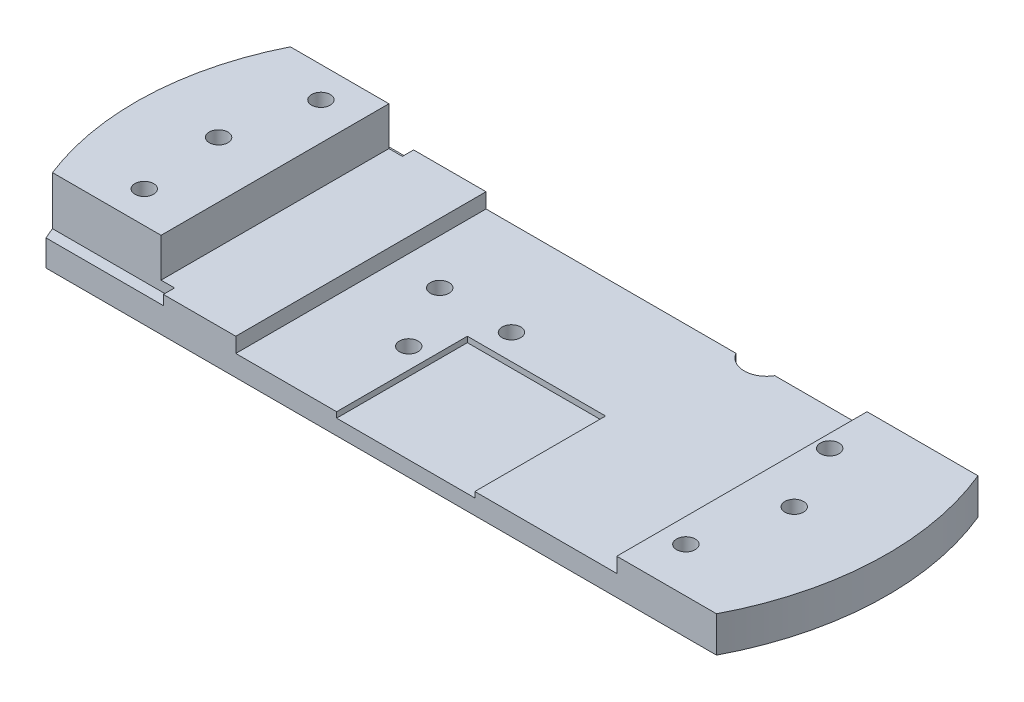
ISO-10303-21;
HEADER;
FILE_DESCRIPTION(('STEP AP214'),'2;1');
FILE_NAME('part.step','',(''),(''),'','','');
FILE_SCHEMA(('AUTOMOTIVE_DESIGN { 1 0 10303 214 1 1 1 1 }'));
ENDSEC;
DATA;
#1=APPLICATION_CONTEXT('core data for automotive mechanical design processes');
#2=APPLICATION_PROTOCOL_DEFINITION('international standard','automotive_design',2000,#1);
#3=PRODUCT_CONTEXT('',#1,'mechanical');
#4=PRODUCT('Part','Part','',(#3));
#5=PRODUCT_RELATED_PRODUCT_CATEGORY('part','',(#4));
#6=PRODUCT_DEFINITION_FORMATION('','',#4);
#7=PRODUCT_DEFINITION_CONTEXT('part definition',#1,'design');
#8=PRODUCT_DEFINITION('design','',#6,#7);
#9=PRODUCT_DEFINITION_SHAPE('','',#8);
#10=(LENGTH_UNIT() NAMED_UNIT(*) SI_UNIT(.MILLI.,.METRE.));
#11=(NAMED_UNIT(*) PLANE_ANGLE_UNIT() SI_UNIT($,.RADIAN.));
#12=(NAMED_UNIT(*) SI_UNIT($,.STERADIAN.) SOLID_ANGLE_UNIT());
#13=UNCERTAINTY_MEASURE_WITH_UNIT(LENGTH_MEASURE(1.E-05),#10,'distance_accuracy_value','');
#14=(GEOMETRIC_REPRESENTATION_CONTEXT(3) GLOBAL_UNCERTAINTY_ASSIGNED_CONTEXT((#13)) GLOBAL_UNIT_ASSIGNED_CONTEXT((#10,
#11,#12)) REPRESENTATION_CONTEXT('',''));
#15=CARTESIAN_POINT('',(0.,0.,0.));
#16=DIRECTION('',(0.,0.,1.));
#17=DIRECTION('',(1.,0.,0.));
#18=AXIS2_PLACEMENT_3D('',#15,#16,#17);
#19=CARTESIAN_POINT('',(0.,20.,0.));
#20=DIRECTION('',(0.,-1.,0.));
#21=DIRECTION('',(0.,0.,-1.));
#22=AXIS2_PLACEMENT_3D('',#19,#20,#21);
#23=PLANE('',#22);
#24=CARTESIAN_POINT('',(-76.2,20.,22.));
#25=DIRECTION('',(0.,-1.,0.));
#26=DIRECTION('',(0.,0.,-1.));
#27=AXIS2_PLACEMENT_3D('',#24,#25,#26);
#28=CIRCLE('',#27,2.50000000000001);
#29=CARTESIAN_POINT('',(-76.2,20.,19.5));
#30=VERTEX_POINT('',#29);
#31=EDGE_CURVE('E319',#30,#30,#28,.T.);
#32=ORIENTED_EDGE('',*,*,#31,.T.);
#33=EDGE_LOOP('',(#32));
#34=FACE_BOUND('',#33,.T.);
#35=CARTESIAN_POINT('',(-78.2,20.,0.100000000000003));
#36=DIRECTION('',(0.,-1.,0.));
#37=DIRECTION('',(0.,0.,-1.));
#38=AXIS2_PLACEMENT_3D('',#35,#36,#37);
#39=CIRCLE('',#38,2.49999999999999);
#40=CARTESIAN_POINT('',(-78.2,20.,-2.39999999999999));
#41=VERTEX_POINT('',#40);
#42=EDGE_CURVE('E327',#41,#41,#39,.T.);
#43=ORIENTED_EDGE('',*,*,#42,.T.);
#44=EDGE_LOOP('',(#43));
#45=FACE_BOUND('',#44,.T.);
#46=CARTESIAN_POINT('',(-73.2,20.,-22.3));
#47=DIRECTION('',(0.,-1.,0.));
#48=DIRECTION('',(0.,0.,-1.));
#49=AXIS2_PLACEMENT_3D('',#46,#47,#48);
#50=CIRCLE('',#49,2.50000000000001);
#51=CARTESIAN_POINT('',(-73.2,20.,-24.8));
#52=VERTEX_POINT('',#51);
#53=EDGE_CURVE('E290',#52,#52,#50,.T.);
#54=ORIENTED_EDGE('',*,*,#53,.T.);
#55=EDGE_LOOP('',(#54));
#56=FACE_BOUND('',#55,.T.);
#57=DIRECTION('',(-1.,0.,0.));
#58=VECTOR('',#57,1.);
#59=CARTESIAN_POINT('',(0.,20.,-30.5));
#60=LINE('',#59,#58);
#61=CARTESIAN_POINT('',(-63.2,20.,-30.5));
#62=VERTEX_POINT('',#61);
#63=CARTESIAN_POINT('',(-89.5873446539231,20.,-30.5));
#64=VERTEX_POINT('',#63);
#65=EDGE_CURVE('E342',#62,#64,#60,.T.);
#66=ORIENTED_EDGE('',*,*,#65,.T.);
#67=CARTESIAN_POINT('',(-22.6589151875398,20.,2.99288439458776));
#68=DIRECTION('',(0.,-1.,0.));
#69=DIRECTION('',(0.,0.,-1.));
#70=AXIS2_PLACEMENT_3D('',#67,#68,#69);
#71=CIRCLE('',#70,74.8410848124602);
#72=CARTESIAN_POINT('',(-92.2616921937509,20.,30.5));
#73=VERTEX_POINT('',#72);
#74=EDGE_CURVE('E476',#73,#64,#71,.T.);
#75=ORIENTED_EDGE('',*,*,#74,.F.);
#76=DIRECTION('',(-1.,0.,0.));
#77=VECTOR('',#76,1.);
#78=CARTESIAN_POINT('',(0.,20.,30.5));
#79=LINE('',#78,#77);
#80=CARTESIAN_POINT('',(-63.2,20.,30.5));
#81=VERTEX_POINT('',#80);
#82=EDGE_CURVE('E371',#81,#73,#79,.T.);
#83=ORIENTED_EDGE('',*,*,#82,.F.);
#84=DIRECTION('',(0.,0.,1.));
#85=VECTOR('',#84,1.);
#86=CARTESIAN_POINT('',(-63.2,20.,-33.5));
#87=LINE('',#86,#85);
#88=EDGE_CURVE('E455',#62,#81,#87,.T.);
#89=ORIENTED_EDGE('',*,*,#88,.F.);
#90=EDGE_LOOP('',(#66,#75,#83,#89));
#91=FACE_BOUND('',#90,.T.);
#92=ADVANCED_FACE('F88',(#34,#45,#56,#91),#23,.F.);
#93=CARTESIAN_POINT('',(-97.5,20.,-33.5));
#94=DIRECTION('',(0.,0.,1.));
#95=DIRECTION('',(1.,0.,0.));
#96=AXIS2_PLACEMENT_3D('',#93,#94,#95);
#97=PLANE('',#96);
#98=DIRECTION('',(0.,1.,0.));
#99=VECTOR('',#98,1.);
#100=CARTESIAN_POINT('',(-59.5873446539231,7.,-33.5));
#101=LINE('',#100,#99);
#102=CARTESIAN_POINT('',(-59.5873446539231,7.,-33.5));
#103=VERTEX_POINT('',#102);
#104=CARTESIAN_POINT('',(-59.5873446539231,9.6,-33.5));
#105=VERTEX_POINT('',#104);
#106=EDGE_CURVE('E360',#103,#105,#101,.T.);
#107=ORIENTED_EDGE('',*,*,#106,.T.);
#108=DIRECTION('',(1.,0.,0.));
#109=VECTOR('',#108,1.);
#110=CARTESIAN_POINT('',(0.,9.6,-33.5));
#111=LINE('',#110,#109);
#112=CARTESIAN_POINT('',(-40.2,9.6,-33.5));
#113=VERTEX_POINT('',#112);
#114=EDGE_CURVE('E410',#105,#113,#111,.T.);
#115=ORIENTED_EDGE('',*,*,#114,.T.);
#116=DIRECTION('',(0.,-1.,0.));
#117=VECTOR('',#116,1.);
#118=CARTESIAN_POINT('',(-40.1999999999999,-2.7894353493707E-13,-33.5));
#119=LINE('',#118,#117);
#120=CARTESIAN_POINT('',(-40.2,5.6,-33.5));
#121=VERTEX_POINT('',#120);
#122=EDGE_CURVE('E413',#113,#121,#119,.T.);
#123=ORIENTED_EDGE('',*,*,#122,.T.);
#124=DIRECTION('',(1.,0.,0.));
#125=VECTOR('',#124,1.);
#126=CARTESIAN_POINT('',(0.,5.6,-33.5));
#127=LINE('',#126,#125);
#128=CARTESIAN_POINT('',(26.7038475772934,5.6,-33.5));
#129=VERTEX_POINT('',#128);
#130=EDGE_CURVE('E418',#121,#129,#127,.T.);
#131=ORIENTED_EDGE('',*,*,#130,.T.);
#132=DIRECTION('',(0.,-1.,0.));
#133=VECTOR('',#132,1.);
#134=CARTESIAN_POINT('',(26.7038475772934,20.,-33.5));
#135=LINE('',#134,#133);
#136=CARTESIAN_POINT('',(26.7038475772934,0.,-33.5));
#137=VERTEX_POINT('',#136);
#138=EDGE_CURVE('E492',#129,#137,#135,.T.);
#139=ORIENTED_EDGE('',*,*,#138,.T.);
#140=DIRECTION('',(-1.,0.,0.));
#141=VECTOR('',#140,1.);
#142=CARTESIAN_POINT('',(-97.5,0.,-33.5));
#143=LINE('',#142,#141);
#144=CARTESIAN_POINT('',(-88.,0.,-33.5));
#145=VERTEX_POINT('',#144);
#146=EDGE_CURVE('E495',#137,#145,#143,.T.);
#147=ORIENTED_EDGE('',*,*,#146,.T.);
#148=DIRECTION('',(0.,-1.,0.));
#149=VECTOR('',#148,1.);
#150=CARTESIAN_POINT('',(-88.,20.,-33.5));
#151=LINE('',#150,#149);
#152=CARTESIAN_POINT('',(-88.,7.,-33.5));
#153=VERTEX_POINT('',#152);
#154=EDGE_CURVE('E472',#153,#145,#151,.T.);
#155=ORIENTED_EDGE('',*,*,#154,.F.);
#156=DIRECTION('',(-1.,0.,0.));
#157=VECTOR('',#156,1.);
#158=CARTESIAN_POINT('',(0.,7.,-33.5));
#159=LINE('',#158,#157);
#160=EDGE_CURVE('E345',#103,#153,#159,.T.);
#161=ORIENTED_EDGE('',*,*,#160,.F.);
#162=EDGE_LOOP('',(#107,#115,#123,#131,#139,#147,#155,#161));
#163=FACE_BOUND('',#162,.T.);
#164=ADVANCED_FACE('F564',(#163),#97,.F.);
#165=CARTESIAN_POINT('',(-22.6589151875398,20.,2.99288439458776));
#166=DIRECTION('',(0.,-1.,0.));
#167=DIRECTION('',(0.,0.,-1.));
#168=AXIS2_PLACEMENT_3D('',#165,#166,#167);
#169=CYLINDRICAL_SURFACE('',#168,74.8410848124602);
#170=ORIENTED_EDGE('',*,*,#74,.T.);
#171=DIRECTION('',(0.,1.,0.));
#172=VECTOR('',#171,1.);
#173=CARTESIAN_POINT('',(-89.5873446539231,7.,-30.5));
#174=LINE('',#173,#172);
#175=CARTESIAN_POINT('',(-89.5873446539231,7.,-30.5));
#176=VERTEX_POINT('',#175);
#177=EDGE_CURVE('E356',#176,#64,#174,.T.);
#178=ORIENTED_EDGE('',*,*,#177,.F.);
#179=CARTESIAN_POINT('',(-22.6589151875398,7.,2.99288439458776));
#180=DIRECTION('',(0.,1.,0.));
#181=DIRECTION('',(0.,0.,1.));
#182=AXIS2_PLACEMENT_3D('',#179,#180,#181);
#183=CIRCLE('',#182,74.8410848124602);
#184=EDGE_CURVE('E348',#153,#176,#183,.T.);
#185=ORIENTED_EDGE('',*,*,#184,.F.);
#186=ORIENTED_EDGE('',*,*,#154,.T.);
#187=CARTESIAN_POINT('',(-22.6589151875398,0.,2.99288439458776));
#188=DIRECTION('',(0.,-1.,0.));
#189=DIRECTION('',(0.,0.,-1.));
#190=AXIS2_PLACEMENT_3D('',#187,#188,#189);
#191=CIRCLE('',#190,74.8410848124602);
#192=CARTESIAN_POINT('',(-91.,0.,33.5));
#193=VERTEX_POINT('',#192);
#194=EDGE_CURVE('E480',#193,#145,#191,.T.);
#195=ORIENTED_EDGE('',*,*,#194,.F.);
#196=DIRECTION('',(0.,-1.,0.));
#197=VECTOR('',#196,1.);
#198=CARTESIAN_POINT('',(-91.,20.,33.5));
#199=LINE('',#198,#197);
#200=CARTESIAN_POINT('',(-91.,7.,33.5));
#201=VERTEX_POINT('',#200);
#202=EDGE_CURVE('E443',#201,#193,#199,.T.);
#203=ORIENTED_EDGE('',*,*,#202,.F.);
#204=CARTESIAN_POINT('',(-22.6589151875398,7.,2.99288439458776));
#205=DIRECTION('',(0.,1.,0.));
#206=DIRECTION('',(0.,0.,1.));
#207=AXIS2_PLACEMENT_3D('',#204,#205,#206);
#208=CIRCLE('',#207,74.8410848124602);
#209=CARTESIAN_POINT('',(-92.2616921937509,7.,30.5));
#210=VERTEX_POINT('',#209);
#211=EDGE_CURVE('E379',#210,#201,#208,.T.);
#212=ORIENTED_EDGE('',*,*,#211,.F.);
#213=DIRECTION('',(0.,1.,0.));
#214=VECTOR('',#213,1.);
#215=CARTESIAN_POINT('',(-92.2616921937509,7.,30.5));
#216=LINE('',#215,#214);
#217=EDGE_CURVE('E355',#210,#73,#216,.T.);
#218=ORIENTED_EDGE('',*,*,#217,.T.);
#219=EDGE_LOOP('',(#170,#178,#185,#186,#195,#203,#212,#218));
#220=FACE_BOUND('',#219,.T.);
#221=ADVANCED_FACE('F570',(#220),#169,.T.);
#222=CARTESIAN_POINT('',(-63.2,0.,-33.5));
#223=DIRECTION('',(-1.,0.,0.));
#224=DIRECTION('',(0.,-1.,0.));
#225=AXIS2_PLACEMENT_3D('',#222,#223,#224);
#226=PLANE('',#225);
#227=DIRECTION('',(0.,-1.,0.));
#228=VECTOR('',#227,1.);
#229=CARTESIAN_POINT('',(-63.2,0.,-30.5));
#230=LINE('',#229,#228);
#231=CARTESIAN_POINT('',(-63.2,9.6,-30.5));
#232=VERTEX_POINT('',#231);
#233=EDGE_CURVE('E397',#62,#232,#230,.T.);
#234=ORIENTED_EDGE('',*,*,#233,.F.);
#235=ORIENTED_EDGE('',*,*,#88,.T.);
#236=DIRECTION('',(0.,-1.,0.));
#237=VECTOR('',#236,1.);
#238=CARTESIAN_POINT('',(-63.2,0.,30.5));
#239=LINE('',#238,#237);
#240=CARTESIAN_POINT('',(-63.2,9.6,30.5));
#241=VERTEX_POINT('',#240);
#242=EDGE_CURVE('E359',#81,#241,#239,.T.);
#243=ORIENTED_EDGE('',*,*,#242,.T.);
#244=DIRECTION('',(0.,0.,1.));
#245=VECTOR('',#244,1.);
#246=CARTESIAN_POINT('',(-63.2,9.6,-33.5));
#247=LINE('',#246,#245);
#248=EDGE_CURVE('E451',#232,#241,#247,.T.);
#249=ORIENTED_EDGE('',*,*,#248,.F.);
#250=EDGE_LOOP('',(#234,#235,#243,#249));
#251=FACE_BOUND('',#250,.T.);
#252=ADVANCED_FACE('F689',(#251),#226,.F.);
#253=CARTESIAN_POINT('',(0.,9.6,-33.5));
#254=DIRECTION('',(0.,-1.,0.));
#255=DIRECTION('',(0.,0.,-1.));
#256=AXIS2_PLACEMENT_3D('',#253,#254,#255);
#257=PLANE('',#256);
#258=DIRECTION('',(1.,0.,0.));
#259=VECTOR('',#258,1.);
#260=CARTESIAN_POINT('',(0.,9.6,-30.5));
#261=LINE('',#260,#259);
#262=CARTESIAN_POINT('',(-59.5873446539231,9.6,-30.5));
#263=VERTEX_POINT('',#262);
#264=EDGE_CURVE('E12',#232,#263,#261,.T.);
#265=ORIENTED_EDGE('',*,*,#264,.F.);
#266=ORIENTED_EDGE('',*,*,#248,.T.);
#267=DIRECTION('',(1.,0.,0.));
#268=VECTOR('',#267,1.);
#269=CARTESIAN_POINT('',(0.,9.6,30.5));
#270=LINE('',#269,#268);
#271=CARTESIAN_POINT('',(-59.5873446539231,9.6,30.5));
#272=VERTEX_POINT('',#271);
#273=EDGE_CURVE('E515',#241,#272,#270,.T.);
#274=ORIENTED_EDGE('',*,*,#273,.T.);
#275=DIRECTION('',(0.,0.,1.));
#276=VECTOR('',#275,1.);
#277=CARTESIAN_POINT('',(-59.5873446539233,9.6,-33.4999999999999));
#278=LINE('',#277,#276);
#279=CARTESIAN_POINT('',(-59.5873446539231,9.6,33.5));
#280=VERTEX_POINT('',#279);
#281=EDGE_CURVE('E511',#272,#280,#278,.T.);
#282=ORIENTED_EDGE('',*,*,#281,.T.);
#283=DIRECTION('',(1.,0.,0.));
#284=VECTOR('',#283,1.);
#285=CARTESIAN_POINT('',(0.,9.6,33.5));
#286=LINE('',#285,#284);
#287=CARTESIAN_POINT('',(-40.2,9.6,33.5));
#288=VERTEX_POINT('',#287);
#289=EDGE_CURVE('E429',#280,#288,#286,.T.);
#290=ORIENTED_EDGE('',*,*,#289,.T.);
#291=DIRECTION('',(0.,0.,1.));
#292=VECTOR('',#291,1.);
#293=CARTESIAN_POINT('',(-40.2,9.6,-33.5));
#294=LINE('',#293,#292);
#295=EDGE_CURVE('E447',#113,#288,#294,.T.);
#296=ORIENTED_EDGE('',*,*,#295,.F.);
#297=ORIENTED_EDGE('',*,*,#114,.F.);
#298=DIRECTION('',(0.,0.,-1.));
#299=VECTOR('',#298,1.);
#300=CARTESIAN_POINT('',(-59.5873446539231,9.6,-33.5));
#301=LINE('',#300,#299);
#302=EDGE_CURVE('E98',#263,#105,#301,.T.);
#303=ORIENTED_EDGE('',*,*,#302,.F.);
#304=EDGE_LOOP('',(#265,#266,#274,#282,#290,#296,#297,#303));
#305=FACE_BOUND('',#304,.T.);
#306=ADVANCED_FACE('F579',(#305),#257,.F.);
#307=CARTESIAN_POINT('',(0.,0.,0.));
#308=DIRECTION('',(0.,-1.,0.));
#309=DIRECTION('',(0.,0.,-1.));
#310=AXIS2_PLACEMENT_3D('',#307,#308,#309);
#311=PLANE('',#310);
#312=CARTESIAN_POINT('',(-8.20000000000003,0.,-8.3));
#313=DIRECTION('',(0.,-1.,0.));
#314=DIRECTION('',(0.,0.,-1.));
#315=AXIS2_PLACEMENT_3D('',#312,#313,#314);
#316=CIRCLE('',#315,2.5);
#317=CARTESIAN_POINT('',(-8.20000000000003,0.,-10.8));
#318=VERTEX_POINT('',#317);
#319=EDGE_CURVE('E310',#318,#318,#316,.T.);
#320=ORIENTED_EDGE('',*,*,#319,.F.);
#321=EDGE_LOOP('',(#320));
#322=FACE_BOUND('',#321,.T.);
#323=CARTESIAN_POINT('',(-18.7,0.,8.7));
#324=DIRECTION('',(0.,-1.,0.));
#325=DIRECTION('',(0.,0.,-1.));
#326=AXIS2_PLACEMENT_3D('',#323,#324,#325);
#327=CIRCLE('',#326,2.5);
#328=CARTESIAN_POINT('',(-18.7,0.,6.2));
#329=VERTEX_POINT('',#328);
#330=EDGE_CURVE('E315',#329,#329,#327,.T.);
#331=ORIENTED_EDGE('',*,*,#330,.F.);
#332=EDGE_LOOP('',(#331));
#333=FACE_BOUND('',#332,.T.);
#334=CARTESIAN_POINT('',(-76.2,0.,22.));
#335=DIRECTION('',(0.,-1.,0.));
#336=DIRECTION('',(0.,0.,-1.));
#337=AXIS2_PLACEMENT_3D('',#334,#335,#336);
#338=CIRCLE('',#337,2.50000000000001);
#339=CARTESIAN_POINT('',(-76.2,0.,19.5));
#340=VERTEX_POINT('',#339);
#341=EDGE_CURVE('E323',#340,#340,#338,.T.);
#342=ORIENTED_EDGE('',*,*,#341,.F.);
#343=EDGE_LOOP('',(#342));
#344=FACE_BOUND('',#343,.T.);
#345=CARTESIAN_POINT('',(-78.2,0.,0.100000000000003));
#346=DIRECTION('',(0.,-1.,0.));
#347=DIRECTION('',(0.,0.,-1.));
#348=AXIS2_PLACEMENT_3D('',#345,#346,#347);
#349=CIRCLE('',#348,2.49999999999999);
#350=CARTESIAN_POINT('',(-78.2,0.,-2.39999999999999));
#351=VERTEX_POINT('',#350);
#352=EDGE_CURVE('E294',#351,#351,#349,.T.);
#353=ORIENTED_EDGE('',*,*,#352,.F.);
#354=EDGE_LOOP('',(#353));
#355=FACE_BOUND('',#354,.T.);
#356=CARTESIAN_POINT('',(-73.2,0.,-22.3));
#357=DIRECTION('',(0.,-1.,0.));
#358=DIRECTION('',(0.,0.,-1.));
#359=AXIS2_PLACEMENT_3D('',#356,#357,#358);
#360=CIRCLE('',#359,2.50000000000001);
#361=CARTESIAN_POINT('',(-73.2,0.,-24.8));
#362=VERTEX_POINT('',#361);
#363=EDGE_CURVE('E295',#362,#362,#360,.T.);
#364=ORIENTED_EDGE('',*,*,#363,.F.);
#365=EDGE_LOOP('',(#364));
#366=FACE_BOUND('',#365,.T.);
#367=CARTESIAN_POINT('',(65.3,0.,-20.));
#368=DIRECTION('',(0.,-1.,0.));
#369=DIRECTION('',(0.,0.,-1.));
#370=AXIS2_PLACEMENT_3D('',#367,#368,#369);
#371=CIRCLE('',#370,2.50000000000001);
#372=CARTESIAN_POINT('',(65.3,0.,-22.5));
#373=VERTEX_POINT('',#372);
#374=EDGE_CURVE('E299',#373,#373,#371,.T.);
#375=ORIENTED_EDGE('',*,*,#374,.F.);
#376=EDGE_LOOP('',(#375));
#377=FACE_BOUND('',#376,.T.);
#378=CARTESIAN_POINT('',(74.1,0.,-1.7));
#379=DIRECTION('',(0.,-1.,0.));
#380=DIRECTION('',(0.,0.,-1.));
#381=AXIS2_PLACEMENT_3D('',#378,#379,#380);
#382=CIRCLE('',#381,2.5);
#383=CARTESIAN_POINT('',(74.1,0.,-4.2));
#384=VERTEX_POINT('',#383);
#385=EDGE_CURVE('E303',#384,#384,#382,.T.);
#386=ORIENTED_EDGE('',*,*,#385,.F.);
#387=EDGE_LOOP('',(#386));
#388=FACE_BOUND('',#387,.T.);
#389=CARTESIAN_POINT('',(68.3,0.,21.5));
#390=DIRECTION('',(0.,-1.,0.));
#391=DIRECTION('',(0.,0.,-1.));
#392=AXIS2_PLACEMENT_3D('',#389,#390,#391);
#393=CIRCLE('',#392,2.5);
#394=CARTESIAN_POINT('',(68.3,0.,19.));
#395=VERTEX_POINT('',#394);
#396=EDGE_CURVE('E284',#395,#395,#393,.T.);
#397=ORIENTED_EDGE('',*,*,#396,.F.);
#398=EDGE_LOOP('',(#397));
#399=FACE_BOUND('',#398,.T.);
#400=CARTESIAN_POINT('',(-28.1,0.,-9.));
#401=DIRECTION('',(0.,-1.,0.));
#402=DIRECTION('',(0.,0.,-1.));
#403=AXIS2_PLACEMENT_3D('',#400,#401,#402);
#404=CIRCLE('',#403,2.5);
#405=CARTESIAN_POINT('',(-28.1,0.,-11.5));
#406=VERTEX_POINT('',#405);
#407=EDGE_CURVE('E314',#406,#406,#404,.T.);
#408=ORIENTED_EDGE('',*,*,#407,.F.);
#409=EDGE_LOOP('',(#408));
#410=FACE_BOUND('',#409,.T.);
#411=CARTESIAN_POINT('',(18.092213290183,0.,-3.21975164372315));
#412=DIRECTION('',(0.,-1.,0.));
#413=DIRECTION('',(0.,0.,-1.));
#414=AXIS2_PLACEMENT_3D('',#411,#412,#413);
#415=CIRCLE('',#414,79.407786709817);
#416=CARTESIAN_POINT('',(91.5,0.,-33.5));
#417=VERTEX_POINT('',#416);
#418=CARTESIAN_POINT('',(88.5,0.,33.5));
#419=VERTEX_POINT('',#418);
#420=EDGE_CURVE('E467',#417,#419,#415,.T.);
#421=ORIENTED_EDGE('',*,*,#420,.T.);
#422=DIRECTION('',(1.,0.,0.));
#423=VECTOR('',#422,1.);
#424=CARTESIAN_POINT('',(-97.5,0.,33.5));
#425=LINE('',#424,#423);
#426=EDGE_CURVE('E500',#193,#419,#425,.T.);
#427=ORIENTED_EDGE('',*,*,#426,.F.);
#428=ORIENTED_EDGE('',*,*,#194,.T.);
#429=ORIENTED_EDGE('',*,*,#146,.F.);
#430=CARTESIAN_POINT('',(31.9,0.,-36.5));
#431=DIRECTION('',(0.,-1.,0.));
#432=DIRECTION('',(0.,0.,-1.));
#433=AXIS2_PLACEMENT_3D('',#430,#431,#432);
#434=CIRCLE('',#433,6.);
#435=CARTESIAN_POINT('',(37.0961524227066,0.,-33.5));
#436=VERTEX_POINT('',#435);
#437=EDGE_CURVE('E464',#436,#137,#434,.T.);
#438=ORIENTED_EDGE('',*,*,#437,.F.);
#439=EDGE_CURVE('E499',#417,#436,#143,.T.);
#440=ORIENTED_EDGE('',*,*,#439,.F.);
#441=EDGE_LOOP('',(#421,#427,#428,#429,#438,#440));
#442=FACE_BOUND('',#441,.T.);
#443=ADVANCED_FACE('F577',(#322,#333,#344,#355,#366,#377,#388,#399,#410,#442),#311,.T.);
#444=CARTESIAN_POINT('',(-97.5,20.,33.5));
#445=DIRECTION('',(0.,0.,-1.));
#446=DIRECTION('',(-1.,0.,0.));
#447=AXIS2_PLACEMENT_3D('',#444,#445,#446);
#448=PLANE('',#447);
#449=DIRECTION('',(1.,0.,0.));
#450=VECTOR('',#449,1.);
#451=CARTESIAN_POINT('',(-13.2,4.1,33.5));
#452=LINE('',#451,#450);
#453=CARTESIAN_POINT('',(-13.2,4.1,33.5));
#454=VERTEX_POINT('',#453);
#455=CARTESIAN_POINT('',(23.8,4.1,33.5));
#456=VERTEX_POINT('',#455);
#457=EDGE_CURVE('E258',#454,#456,#452,.T.);
#458=ORIENTED_EDGE('',*,*,#457,.F.);
#459=DIRECTION('',(0.,1.,0.));
#460=VECTOR('',#459,1.);
#461=CARTESIAN_POINT('',(-13.2,4.1,33.5));
#462=LINE('',#461,#460);
#463=CARTESIAN_POINT('',(-13.2,5.6,33.5));
#464=VERTEX_POINT('',#463);
#465=EDGE_CURVE('E240',#454,#464,#462,.T.);
#466=ORIENTED_EDGE('',*,*,#465,.T.);
#467=DIRECTION('',(1.,0.,0.));
#468=VECTOR('',#467,1.);
#469=CARTESIAN_POINT('',(0.,5.6,33.5));
#470=LINE('',#469,#468);
#471=CARTESIAN_POINT('',(-40.2,5.6,33.5));
#472=VERTEX_POINT('',#471);
#473=EDGE_CURVE('E406',#472,#464,#470,.T.);
#474=ORIENTED_EDGE('',*,*,#473,.F.);
#475=DIRECTION('',(0.,-1.,0.));
#476=VECTOR('',#475,1.);
#477=CARTESIAN_POINT('',(-40.1999999999999,-2.7894353493707E-13,33.5));
#478=LINE('',#477,#476);
#479=EDGE_CURVE('E432',#288,#472,#478,.T.);
#480=ORIENTED_EDGE('',*,*,#479,.F.);
#481=ORIENTED_EDGE('',*,*,#289,.F.);
#482=DIRECTION('',(0.,1.,0.));
#483=VECTOR('',#482,1.);
#484=CARTESIAN_POINT('',(-59.5873446539231,7.,33.5));
#485=LINE('',#484,#483);
#486=CARTESIAN_POINT('',(-59.5873446539231,7.,33.5));
#487=VERTEX_POINT('',#486);
#488=EDGE_CURVE('E382',#487,#280,#485,.T.);
#489=ORIENTED_EDGE('',*,*,#488,.F.);
#490=DIRECTION('',(1.,0.,0.));
#491=VECTOR('',#490,1.);
#492=CARTESIAN_POINT('',(0.,7.,33.5));
#493=LINE('',#492,#491);
#494=EDGE_CURVE('E366',#201,#487,#493,.T.);
#495=ORIENTED_EDGE('',*,*,#494,.F.);
#496=ORIENTED_EDGE('',*,*,#202,.T.);
#497=ORIENTED_EDGE('',*,*,#426,.T.);
#498=DIRECTION('',(0.,-1.,0.));
#499=VECTOR('',#498,1.);
#500=CARTESIAN_POINT('',(88.5,20.,33.5));
#501=LINE('',#500,#499);
#502=CARTESIAN_POINT('',(88.5,9.59999999999996,33.5));
#503=VERTEX_POINT('',#502);
#504=EDGE_CURVE('E461',#503,#419,#501,.T.);
#505=ORIENTED_EDGE('',*,*,#504,.F.);
#506=DIRECTION('',(1.,0.,0.));
#507=VECTOR('',#506,1.);
#508=CARTESIAN_POINT('',(0.,9.6,33.5));
#509=LINE('',#508,#507);
#510=CARTESIAN_POINT('',(61.8,9.59999999999997,33.5));
#511=VERTEX_POINT('',#510);
#512=EDGE_CURVE('E426',#511,#503,#509,.T.);
#513=ORIENTED_EDGE('',*,*,#512,.F.);
#514=DIRECTION('',(0.,1.,0.));
#515=VECTOR('',#514,1.);
#516=CARTESIAN_POINT('',(61.8,0.,33.5));
#517=LINE('',#516,#515);
#518=CARTESIAN_POINT('',(61.8,5.59999999999999,33.5));
#519=VERTEX_POINT('',#518);
#520=EDGE_CURVE('E400',#519,#511,#517,.T.);
#521=ORIENTED_EDGE('',*,*,#520,.F.);
#522=CARTESIAN_POINT('',(23.8,5.6,33.5));
#523=VERTEX_POINT('',#522);
#524=EDGE_CURVE('E436',#523,#519,#470,.T.);
#525=ORIENTED_EDGE('',*,*,#524,.F.);
#526=DIRECTION('',(0.,1.,0.));
#527=VECTOR('',#526,1.);
#528=CARTESIAN_POINT('',(23.8,4.1,33.5));
#529=LINE('',#528,#527);
#530=EDGE_CURVE('E106',#456,#523,#529,.T.);
#531=ORIENTED_EDGE('',*,*,#530,.F.);
#532=EDGE_LOOP('',(#458,#466,#474,#480,#481,#489,#495,#496,#497,#505,#513,#521,#525,#531));
#533=FACE_BOUND('',#532,.T.);
#534=ADVANCED_FACE('F263',(#533),#448,.F.);
#535=DIRECTION('',(0.,-1.,0.));
#536=VECTOR('',#535,1.);
#537=CARTESIAN_POINT('',(37.0961524227066,20.,-33.5));
#538=LINE('',#537,#536);
#539=CARTESIAN_POINT('',(37.0961524227066,5.6,-33.5));
#540=VERTEX_POINT('',#539);
#541=EDGE_CURVE('E475',#436,#540,#538,.F.);
#542=ORIENTED_EDGE('',*,*,#541,.T.);
#543=CARTESIAN_POINT('',(61.8,5.59999999999999,-33.5));
#544=VERTEX_POINT('',#543);
#545=EDGE_CURVE('E417',#540,#544,#127,.T.);
#546=ORIENTED_EDGE('',*,*,#545,.T.);
#547=DIRECTION('',(0.,1.,0.));
#548=VECTOR('',#547,1.);
#549=CARTESIAN_POINT('',(61.8,0.,-33.5));
#550=LINE('',#549,#548);
#551=CARTESIAN_POINT('',(61.8,9.59999999999997,-33.5));
#552=VERTEX_POINT('',#551);
#553=EDGE_CURVE('E401',#544,#552,#550,.T.);
#554=ORIENTED_EDGE('',*,*,#553,.T.);
#555=DIRECTION('',(1.,0.,0.));
#556=VECTOR('',#555,1.);
#557=CARTESIAN_POINT('',(0.,9.6,-33.5));
#558=LINE('',#557,#556);
#559=CARTESIAN_POINT('',(91.5,9.59999999999996,-33.5));
#560=VERTEX_POINT('',#559);
#561=EDGE_CURVE('E405',#552,#560,#558,.T.);
#562=ORIENTED_EDGE('',*,*,#561,.T.);
#563=DIRECTION('',(0.,-1.,0.));
#564=VECTOR('',#563,1.);
#565=CARTESIAN_POINT('',(91.5,20.,-33.5));
#566=LINE('',#565,#564);
#567=EDGE_CURVE('E471',#560,#417,#566,.T.);
#568=ORIENTED_EDGE('',*,*,#567,.T.);
#569=ORIENTED_EDGE('',*,*,#439,.T.);
#570=EDGE_LOOP('',(#542,#546,#554,#562,#568,#569));
#571=FACE_BOUND('',#570,.T.);
#572=ADVANCED_FACE('F90',(#571),#97,.F.);
#573=CARTESIAN_POINT('',(31.9,20.,-36.5));
#574=DIRECTION('',(0.,-1.,0.));
#575=DIRECTION('',(0.,0.,-1.));
#576=AXIS2_PLACEMENT_3D('',#573,#574,#575);
#577=CYLINDRICAL_SURFACE('',#576,6.);
#578=ORIENTED_EDGE('',*,*,#138,.F.);
#579=CARTESIAN_POINT('',(31.9,5.6,-36.5));
#580=DIRECTION('',(0.,-1.,0.));
#581=DIRECTION('',(1.,0.,0.));
#582=AXIS2_PLACEMENT_3D('',#579,#580,#581);
#583=CIRCLE('',#582,6.);
#584=EDGE_CURVE('E507',#129,#540,#583,.F.);
#585=ORIENTED_EDGE('',*,*,#584,.T.);
#586=ORIENTED_EDGE('',*,*,#541,.F.);
#587=ORIENTED_EDGE('',*,*,#437,.T.);
#588=EDGE_LOOP('',(#578,#585,#586,#587));
#589=FACE_BOUND('',#588,.T.);
#590=ADVANCED_FACE('F575',(#589),#577,.F.);
#591=CARTESIAN_POINT('',(18.092213290183,20.,-3.21975164372315));
#592=DIRECTION('',(0.,-1.,0.));
#593=DIRECTION('',(0.,0.,-1.));
#594=AXIS2_PLACEMENT_3D('',#591,#592,#593);
#595=CYLINDRICAL_SURFACE('',#594,79.407786709817);
#596=ORIENTED_EDGE('',*,*,#567,.F.);
#597=CARTESIAN_POINT('',(18.092213290183,9.59999999999999,-3.21975164372315));
#598=DIRECTION('',(0.,-1.,0.));
#599=DIRECTION('',(1.,0.,0.));
#600=AXIS2_PLACEMENT_3D('',#597,#598,#599);
#601=CIRCLE('',#600,79.407786709817);
#602=EDGE_CURVE('E504',#503,#560,#601,.F.);
#603=ORIENTED_EDGE('',*,*,#602,.F.);
#604=ORIENTED_EDGE('',*,*,#504,.T.);
#605=ORIENTED_EDGE('',*,*,#420,.F.);
#606=EDGE_LOOP('',(#596,#603,#604,#605));
#607=FACE_BOUND('',#606,.T.);
#608=ADVANCED_FACE('F589',(#607),#595,.T.);
#609=CARTESIAN_POINT('',(0.,5.6,-33.5));
#610=DIRECTION('',(0.,-1.,0.));
#611=DIRECTION('',(1.,0.,0.));
#612=AXIS2_PLACEMENT_3D('',#609,#610,#611);
#613=PLANE('',#612);
#614=CARTESIAN_POINT('',(-8.20000000000003,5.6,-8.3));
#615=DIRECTION('',(0.,-1.,0.));
#616=DIRECTION('',(1.,0.,0.));
#617=AXIS2_PLACEMENT_3D('',#614,#615,#616);
#618=CIRCLE('',#617,2.5);
#619=CARTESIAN_POINT('',(-5.70000000000003,5.6,-8.3));
#620=VERTEX_POINT('',#619);
#621=EDGE_CURVE('E92',#620,#620,#618,.T.);
#622=ORIENTED_EDGE('',*,*,#621,.T.);
#623=EDGE_LOOP('',(#622));
#624=FACE_BOUND('',#623,.T.);
#625=CARTESIAN_POINT('',(-18.7,5.6,8.7));
#626=DIRECTION('',(0.,-1.,0.));
#627=DIRECTION('',(1.,0.,0.));
#628=AXIS2_PLACEMENT_3D('',#625,#626,#627);
#629=CIRCLE('',#628,2.5);
#630=CARTESIAN_POINT('',(-16.2,5.6,8.7));
#631=VERTEX_POINT('',#630);
#632=EDGE_CURVE('E535',#631,#631,#629,.T.);
#633=ORIENTED_EDGE('',*,*,#632,.T.);
#634=EDGE_LOOP('',(#633));
#635=FACE_BOUND('',#634,.T.);
#636=CARTESIAN_POINT('',(-28.1,5.6,-9.));
#637=DIRECTION('',(0.,-1.,0.));
#638=DIRECTION('',(1.,0.,0.));
#639=AXIS2_PLACEMENT_3D('',#636,#637,#638);
#640=CIRCLE('',#639,2.5);
#641=CARTESIAN_POINT('',(-25.6,5.6,-9.));
#642=VERTEX_POINT('',#641);
#643=EDGE_CURVE('E532',#642,#642,#640,.T.);
#644=ORIENTED_EDGE('',*,*,#643,.T.);
#645=EDGE_LOOP('',(#644));
#646=FACE_BOUND('',#645,.T.);
#647=ORIENTED_EDGE('',*,*,#473,.T.);
#648=DIRECTION('',(0.,0.,1.));
#649=VECTOR('',#648,1.);
#650=CARTESIAN_POINT('',(-13.2,5.6,-1.5));
#651=LINE('',#650,#649);
#652=CARTESIAN_POINT('',(-13.2,5.6,-1.5));
#653=VERTEX_POINT('',#652);
#654=EDGE_CURVE('E246',#653,#464,#651,.T.);
#655=ORIENTED_EDGE('',*,*,#654,.F.);
#656=DIRECTION('',(-1.,0.,0.));
#657=VECTOR('',#656,1.);
#658=CARTESIAN_POINT('',(-13.2,5.6,-1.5));
#659=LINE('',#658,#657);
#660=CARTESIAN_POINT('',(23.8,5.6,-1.5));
#661=VERTEX_POINT('',#660);
#662=EDGE_CURVE('E261',#661,#653,#659,.T.);
#663=ORIENTED_EDGE('',*,*,#662,.F.);
#664=DIRECTION('',(0.,0.,-1.));
#665=VECTOR('',#664,1.);
#666=CARTESIAN_POINT('',(23.8,5.6,-1.5));
#667=LINE('',#666,#665);
#668=EDGE_CURVE('E275',#523,#661,#667,.T.);
#669=ORIENTED_EDGE('',*,*,#668,.F.);
#670=ORIENTED_EDGE('',*,*,#524,.T.);
#671=DIRECTION('',(0.,0.,1.));
#672=VECTOR('',#671,1.);
#673=CARTESIAN_POINT('',(61.8,5.59999999999999,-33.5));
#674=LINE('',#673,#672);
#675=EDGE_CURVE('E439',#544,#519,#674,.T.);
#676=ORIENTED_EDGE('',*,*,#675,.F.);
#677=ORIENTED_EDGE('',*,*,#545,.F.);
#678=ORIENTED_EDGE('',*,*,#584,.F.);
#679=ORIENTED_EDGE('',*,*,#130,.F.);
#680=DIRECTION('',(0.,0.,1.));
#681=VECTOR('',#680,1.);
#682=CARTESIAN_POINT('',(-40.2,5.6,-33.5));
#683=LINE('',#682,#681);
#684=EDGE_CURVE('E444',#121,#472,#683,.T.);
#685=ORIENTED_EDGE('',*,*,#684,.T.);
#686=EDGE_LOOP('',(#647,#655,#663,#669,#670,#676,#677,#678,#679,#685));
#687=FACE_BOUND('',#686,.T.);
#688=ADVANCED_FACE('F544',(#624,#635,#646,#687),#613,.F.);
#689=CARTESIAN_POINT('',(-40.1999999999999,-2.7894353493707E-13,-33.5));
#690=DIRECTION('',(-1.,0.,0.));
#691=DIRECTION('',(0.,-1.,0.));
#692=AXIS2_PLACEMENT_3D('',#689,#690,#691);
#693=PLANE('',#692);
#694=ORIENTED_EDGE('',*,*,#479,.T.);
#695=ORIENTED_EDGE('',*,*,#684,.F.);
#696=ORIENTED_EDGE('',*,*,#122,.F.);
#697=ORIENTED_EDGE('',*,*,#295,.T.);
#698=EDGE_LOOP('',(#694,#695,#696,#697));
#699=FACE_BOUND('',#698,.T.);
#700=ADVANCED_FACE('F640',(#699),#693,.F.);
#701=CARTESIAN_POINT('',(61.8,0.,-33.5));
#702=DIRECTION('',(1.,0.,0.));
#703=DIRECTION('',(0.,0.,-1.));
#704=AXIS2_PLACEMENT_3D('',#701,#702,#703);
#705=PLANE('',#704);
#706=ORIENTED_EDGE('',*,*,#520,.T.);
#707=DIRECTION('',(0.,0.,1.));
#708=VECTOR('',#707,1.);
#709=CARTESIAN_POINT('',(61.8,9.59999999999997,-33.5));
#710=LINE('',#709,#708);
#711=EDGE_CURVE('E422',#552,#511,#710,.T.);
#712=ORIENTED_EDGE('',*,*,#711,.F.);
#713=ORIENTED_EDGE('',*,*,#553,.F.);
#714=ORIENTED_EDGE('',*,*,#675,.T.);
#715=EDGE_LOOP('',(#706,#712,#713,#714));
#716=FACE_BOUND('',#715,.T.);
#717=ADVANCED_FACE('F611',(#716),#705,.F.);
#718=CARTESIAN_POINT('',(0.,9.6,-33.5));
#719=DIRECTION('',(0.,-1.,0.));
#720=DIRECTION('',(1.,0.,0.));
#721=AXIS2_PLACEMENT_3D('',#718,#719,#720);
#722=PLANE('',#721);
#723=CARTESIAN_POINT('',(65.3,9.59999999999997,-20.));
#724=DIRECTION('',(0.,-1.,0.));
#725=DIRECTION('',(1.,0.,0.));
#726=AXIS2_PLACEMENT_3D('',#723,#724,#725);
#727=CIRCLE('',#726,2.50000000000001);
#728=CARTESIAN_POINT('',(67.8,9.59999999999997,-20.));
#729=VERTEX_POINT('',#728);
#730=EDGE_CURVE('E528',#729,#729,#727,.T.);
#731=ORIENTED_EDGE('',*,*,#730,.T.);
#732=EDGE_LOOP('',(#731));
#733=FACE_BOUND('',#732,.T.);
#734=CARTESIAN_POINT('',(74.1,9.59999999999997,-1.7));
#735=DIRECTION('',(0.,-1.,0.));
#736=DIRECTION('',(1.,0.,0.));
#737=AXIS2_PLACEMENT_3D('',#734,#735,#736);
#738=CIRCLE('',#737,2.5);
#739=CARTESIAN_POINT('',(76.6,9.59999999999997,-1.7));
#740=VERTEX_POINT('',#739);
#741=EDGE_CURVE('E524',#740,#740,#738,.T.);
#742=ORIENTED_EDGE('',*,*,#741,.T.);
#743=EDGE_LOOP('',(#742));
#744=FACE_BOUND('',#743,.T.);
#745=CARTESIAN_POINT('',(68.3,9.59999999999997,21.5));
#746=DIRECTION('',(0.,-1.,0.));
#747=DIRECTION('',(1.,0.,0.));
#748=AXIS2_PLACEMENT_3D('',#745,#746,#747);
#749=CIRCLE('',#748,2.5);
#750=CARTESIAN_POINT('',(70.8,9.59999999999997,21.5));
#751=VERTEX_POINT('',#750);
#752=EDGE_CURVE('E337',#751,#751,#749,.T.);
#753=ORIENTED_EDGE('',*,*,#752,.T.);
#754=EDGE_LOOP('',(#753));
#755=FACE_BOUND('',#754,.T.);
#756=ORIENTED_EDGE('',*,*,#602,.T.);
#757=ORIENTED_EDGE('',*,*,#561,.F.);
#758=ORIENTED_EDGE('',*,*,#711,.T.);
#759=ORIENTED_EDGE('',*,*,#512,.T.);
#760=EDGE_LOOP('',(#756,#757,#758,#759));
#761=FACE_BOUND('',#760,.T.);
#762=ADVANCED_FACE('F616',(#733,#744,#755,#761),#722,.F.);
#763=CARTESIAN_POINT('',(0.,7.,30.5));
#764=DIRECTION('',(0.,0.,-1.));
#765=DIRECTION('',(-1.,0.,0.));
#766=AXIS2_PLACEMENT_3D('',#763,#764,#765);
#767=PLANE('',#766);
#768=ORIENTED_EDGE('',*,*,#82,.T.);
#769=ORIENTED_EDGE('',*,*,#217,.F.);
#770=DIRECTION('',(-1.,0.,0.));
#771=VECTOR('',#770,1.);
#772=CARTESIAN_POINT('',(0.,7.,30.5));
#773=LINE('',#772,#771);
#774=CARTESIAN_POINT('',(-59.5873446539231,7.,30.5));
#775=VERTEX_POINT('',#774);
#776=EDGE_CURVE('E375',#775,#210,#773,.T.);
#777=ORIENTED_EDGE('',*,*,#776,.F.);
#778=DIRECTION('',(0.,1.,0.));
#779=VECTOR('',#778,1.);
#780=CARTESIAN_POINT('',(-59.5873446539231,7.,30.5));
#781=LINE('',#780,#779);
#782=EDGE_CURVE('E388',#775,#272,#781,.T.);
#783=ORIENTED_EDGE('',*,*,#782,.T.);
#784=ORIENTED_EDGE('',*,*,#273,.F.);
#785=ORIENTED_EDGE('',*,*,#242,.F.);
#786=EDGE_LOOP('',(#768,#769,#777,#783,#784,#785));
#787=FACE_BOUND('',#786,.T.);
#788=ADVANCED_FACE('F676',(#787),#767,.F.);
#789=CARTESIAN_POINT('',(-59.5873446539232,7.,1.37823420856376E-13));
#790=DIRECTION('',(1.,0.,0.));
#791=DIRECTION('',(0.,0.,-1.));
#792=AXIS2_PLACEMENT_3D('',#789,#790,#791);
#793=PLANE('',#792);
#794=ORIENTED_EDGE('',*,*,#782,.F.);
#795=DIRECTION('',(0.,0.,-1.));
#796=VECTOR('',#795,1.);
#797=CARTESIAN_POINT('',(-59.5873446539232,7.,1.37823420856376E-13));
#798=LINE('',#797,#796);
#799=EDGE_CURVE('E370',#487,#775,#798,.T.);
#800=ORIENTED_EDGE('',*,*,#799,.F.);
#801=ORIENTED_EDGE('',*,*,#488,.T.);
#802=ORIENTED_EDGE('',*,*,#281,.F.);
#803=EDGE_LOOP('',(#794,#800,#801,#802));
#804=FACE_BOUND('',#803,.T.);
#805=ADVANCED_FACE('F683',(#804),#793,.F.);
#806=CARTESIAN_POINT('',(0.,7.,0.));
#807=DIRECTION('',(0.,1.,0.));
#808=DIRECTION('',(0.,0.,1.));
#809=AXIS2_PLACEMENT_3D('',#806,#807,#808);
#810=PLANE('',#809);
#811=ORIENTED_EDGE('',*,*,#494,.T.);
#812=ORIENTED_EDGE('',*,*,#799,.T.);
#813=ORIENTED_EDGE('',*,*,#776,.T.);
#814=ORIENTED_EDGE('',*,*,#211,.T.);
#815=EDGE_LOOP('',(#811,#812,#813,#814));
#816=FACE_BOUND('',#815,.T.);
#817=ADVANCED_FACE('F710',(#816),#810,.T.);
#818=CARTESIAN_POINT('',(0.,7.,-30.5));
#819=DIRECTION('',(0.,0.,-1.));
#820=DIRECTION('',(-1.,0.,0.));
#821=AXIS2_PLACEMENT_3D('',#818,#819,#820);
#822=PLANE('',#821);
#823=ORIENTED_EDGE('',*,*,#233,.T.);
#824=ORIENTED_EDGE('',*,*,#264,.T.);
#825=DIRECTION('',(0.,1.,0.));
#826=VECTOR('',#825,1.);
#827=CARTESIAN_POINT('',(-59.5873446539231,7.,-30.5));
#828=LINE('',#827,#826);
#829=CARTESIAN_POINT('',(-59.5873446539231,7.,-30.5));
#830=VERTEX_POINT('',#829);
#831=EDGE_CURVE('E114',#830,#263,#828,.T.);
#832=ORIENTED_EDGE('',*,*,#831,.F.);
#833=DIRECTION('',(-1.,0.,0.));
#834=VECTOR('',#833,1.);
#835=CARTESIAN_POINT('',(0.,7.,-30.5));
#836=LINE('',#835,#834);
#837=EDGE_CURVE('E338',#830,#176,#836,.T.);
#838=ORIENTED_EDGE('',*,*,#837,.T.);
#839=ORIENTED_EDGE('',*,*,#177,.T.);
#840=ORIENTED_EDGE('',*,*,#65,.F.);
#841=EDGE_LOOP('',(#823,#824,#832,#838,#839,#840));
#842=FACE_BOUND('',#841,.T.);
#843=ADVANCED_FACE('F712',(#842),#822,.T.);
#844=CARTESIAN_POINT('',(-59.5873446539231,7.,0.));
#845=DIRECTION('',(-1.,0.,0.));
#846=DIRECTION('',(0.,0.,1.));
#847=AXIS2_PLACEMENT_3D('',#844,#845,#846);
#848=PLANE('',#847);
#849=ORIENTED_EDGE('',*,*,#302,.T.);
#850=ORIENTED_EDGE('',*,*,#106,.F.);
#851=DIRECTION('',(0.,0.,1.));
#852=VECTOR('',#851,1.);
#853=CARTESIAN_POINT('',(-59.5873446539231,7.,0.));
#854=LINE('',#853,#852);
#855=EDGE_CURVE('E341',#103,#830,#854,.T.);
#856=ORIENTED_EDGE('',*,*,#855,.T.);
#857=ORIENTED_EDGE('',*,*,#831,.T.);
#858=EDGE_LOOP('',(#849,#850,#856,#857));
#859=FACE_BOUND('',#858,.T.);
#860=ADVANCED_FACE('F669',(#859),#848,.T.);
#861=CARTESIAN_POINT('',(0.,7.,0.));
#862=DIRECTION('',(0.,1.,0.));
#863=DIRECTION('',(0.,0.,1.));
#864=AXIS2_PLACEMENT_3D('',#861,#862,#863);
#865=PLANE('',#864);
#866=ORIENTED_EDGE('',*,*,#837,.F.);
#867=ORIENTED_EDGE('',*,*,#855,.F.);
#868=ORIENTED_EDGE('',*,*,#160,.T.);
#869=ORIENTED_EDGE('',*,*,#184,.T.);
#870=EDGE_LOOP('',(#866,#867,#868,#869));
#871=FACE_BOUND('',#870,.T.);
#872=ADVANCED_FACE('F630',(#871),#865,.T.);
#873=CARTESIAN_POINT('',(68.3,20.,21.5));
#874=DIRECTION('',(0.,-1.,0.));
#875=DIRECTION('',(0.,0.,-1.));
#876=AXIS2_PLACEMENT_3D('',#873,#874,#875);
#877=CYLINDRICAL_SURFACE('',#876,2.5);
#878=ORIENTED_EDGE('',*,*,#396,.T.);
#879=EDGE_LOOP('',(#878));
#880=FACE_BOUND('',#879,.T.);
#881=ORIENTED_EDGE('',*,*,#752,.F.);
#882=EDGE_LOOP('',(#881));
#883=FACE_BOUND('',#882,.T.);
#884=ADVANCED_FACE('F662',(#880,#883),#877,.F.);
#885=CARTESIAN_POINT('',(74.1,20.,-1.7));
#886=DIRECTION('',(0.,-1.,0.));
#887=DIRECTION('',(0.,0.,-1.));
#888=AXIS2_PLACEMENT_3D('',#885,#886,#887);
#889=CYLINDRICAL_SURFACE('',#888,2.5);
#890=ORIENTED_EDGE('',*,*,#385,.T.);
#891=EDGE_LOOP('',(#890));
#892=FACE_BOUND('',#891,.T.);
#893=ORIENTED_EDGE('',*,*,#741,.F.);
#894=EDGE_LOOP('',(#893));
#895=FACE_BOUND('',#894,.T.);
#896=ADVANCED_FACE('F659',(#892,#895),#889,.F.);
#897=CARTESIAN_POINT('',(65.3,20.,-20.));
#898=DIRECTION('',(0.,-1.,0.));
#899=DIRECTION('',(0.,0.,-1.));
#900=AXIS2_PLACEMENT_3D('',#897,#898,#899);
#901=CYLINDRICAL_SURFACE('',#900,2.50000000000001);
#902=ORIENTED_EDGE('',*,*,#374,.T.);
#903=EDGE_LOOP('',(#902));
#904=FACE_BOUND('',#903,.T.);
#905=ORIENTED_EDGE('',*,*,#730,.F.);
#906=EDGE_LOOP('',(#905));
#907=FACE_BOUND('',#906,.T.);
#908=ADVANCED_FACE('F656',(#904,#907),#901,.F.);
#909=CARTESIAN_POINT('',(-28.1,20.,-9.));
#910=DIRECTION('',(0.,-1.,0.));
#911=DIRECTION('',(0.,0.,-1.));
#912=AXIS2_PLACEMENT_3D('',#909,#910,#911);
#913=CYLINDRICAL_SURFACE('',#912,2.5);
#914=ORIENTED_EDGE('',*,*,#407,.T.);
#915=EDGE_LOOP('',(#914));
#916=FACE_BOUND('',#915,.T.);
#917=ORIENTED_EDGE('',*,*,#643,.F.);
#918=EDGE_LOOP('',(#917));
#919=FACE_BOUND('',#918,.T.);
#920=ADVANCED_FACE('F559',(#916,#919),#913,.F.);
#921=CARTESIAN_POINT('',(-18.7,20.,8.7));
#922=DIRECTION('',(0.,-1.,0.));
#923=DIRECTION('',(0.,0.,-1.));
#924=AXIS2_PLACEMENT_3D('',#921,#922,#923);
#925=CYLINDRICAL_SURFACE('',#924,2.5);
#926=ORIENTED_EDGE('',*,*,#330,.T.);
#927=EDGE_LOOP('',(#926));
#928=FACE_BOUND('',#927,.T.);
#929=ORIENTED_EDGE('',*,*,#632,.F.);
#930=EDGE_LOOP('',(#929));
#931=FACE_BOUND('',#930,.T.);
#932=ADVANCED_FACE('F549',(#928,#931),#925,.F.);
#933=CARTESIAN_POINT('',(-8.20000000000003,20.,-8.3));
#934=DIRECTION('',(0.,-1.,0.));
#935=DIRECTION('',(0.,0.,-1.));
#936=AXIS2_PLACEMENT_3D('',#933,#934,#935);
#937=CYLINDRICAL_SURFACE('',#936,2.5);
#938=ORIENTED_EDGE('',*,*,#319,.T.);
#939=EDGE_LOOP('',(#938));
#940=FACE_BOUND('',#939,.T.);
#941=ORIENTED_EDGE('',*,*,#621,.F.);
#942=EDGE_LOOP('',(#941));
#943=FACE_BOUND('',#942,.T.);
#944=ADVANCED_FACE('F546',(#940,#943),#937,.F.);
#945=CARTESIAN_POINT('',(-73.2,20.,-22.3));
#946=DIRECTION('',(0.,-1.,0.));
#947=DIRECTION('',(0.,0.,-1.));
#948=AXIS2_PLACEMENT_3D('',#945,#946,#947);
#949=CYLINDRICAL_SURFACE('',#948,2.50000000000001);
#950=ORIENTED_EDGE('',*,*,#53,.F.);
#951=EDGE_LOOP('',(#950));
#952=FACE_BOUND('',#951,.T.);
#953=ORIENTED_EDGE('',*,*,#363,.T.);
#954=EDGE_LOOP('',(#953));
#955=FACE_BOUND('',#954,.T.);
#956=ADVANCED_FACE('F548',(#952,#955),#949,.F.);
#957=CARTESIAN_POINT('',(-78.2,20.,0.100000000000003));
#958=DIRECTION('',(0.,-1.,0.));
#959=DIRECTION('',(0.,0.,-1.));
#960=AXIS2_PLACEMENT_3D('',#957,#958,#959);
#961=CYLINDRICAL_SURFACE('',#960,2.49999999999999);
#962=ORIENTED_EDGE('',*,*,#42,.F.);
#963=EDGE_LOOP('',(#962));
#964=FACE_BOUND('',#963,.T.);
#965=ORIENTED_EDGE('',*,*,#352,.T.);
#966=EDGE_LOOP('',(#965));
#967=FACE_BOUND('',#966,.T.);
#968=ADVANCED_FACE('F556',(#964,#967),#961,.F.);
#969=CARTESIAN_POINT('',(-76.2,20.,22.));
#970=DIRECTION('',(0.,-1.,0.));
#971=DIRECTION('',(0.,0.,-1.));
#972=AXIS2_PLACEMENT_3D('',#969,#970,#971);
#973=CYLINDRICAL_SURFACE('',#972,2.50000000000001);
#974=ORIENTED_EDGE('',*,*,#31,.F.);
#975=EDGE_LOOP('',(#974));
#976=FACE_BOUND('',#975,.T.);
#977=ORIENTED_EDGE('',*,*,#341,.T.);
#978=EDGE_LOOP('',(#977));
#979=FACE_BOUND('',#978,.T.);
#980=ADVANCED_FACE('F654',(#976,#979),#973,.F.);
#981=CARTESIAN_POINT('',(-13.2,4.1,-1.5));
#982=DIRECTION('',(-1.,0.,0.));
#983=DIRECTION('',(0.,0.,1.));
#984=AXIS2_PLACEMENT_3D('',#981,#982,#983);
#985=PLANE('',#984);
#986=ORIENTED_EDGE('',*,*,#654,.T.);
#987=ORIENTED_EDGE('',*,*,#465,.F.);
#988=DIRECTION('',(0.,0.,1.));
#989=VECTOR('',#988,1.);
#990=CARTESIAN_POINT('',(-13.2,4.1,-1.5));
#991=LINE('',#990,#989);
#992=CARTESIAN_POINT('',(-13.2,4.1,-1.5));
#993=VERTEX_POINT('',#992);
#994=EDGE_CURVE('E243',#993,#454,#991,.T.);
#995=ORIENTED_EDGE('',*,*,#994,.F.);
#996=DIRECTION('',(0.,1.,0.));
#997=VECTOR('',#996,1.);
#998=CARTESIAN_POINT('',(-13.2,4.1,-1.5));
#999=LINE('',#998,#997);
#1000=EDGE_CURVE('E281',#993,#653,#999,.T.);
#1001=ORIENTED_EDGE('',*,*,#1000,.T.);
#1002=EDGE_LOOP('',(#986,#987,#995,#1001));
#1003=FACE_BOUND('',#1002,.T.);
#1004=ADVANCED_FACE('F242',(#1003),#985,.F.);
#1005=CARTESIAN_POINT('',(-13.2,4.1,-1.5));
#1006=DIRECTION('',(0.,0.,-1.));
#1007=DIRECTION('',(-1.,0.,0.));
#1008=AXIS2_PLACEMENT_3D('',#1005,#1006,#1007);
#1009=PLANE('',#1008);
#1010=ORIENTED_EDGE('',*,*,#662,.T.);
#1011=ORIENTED_EDGE('',*,*,#1000,.F.);
#1012=DIRECTION('',(-1.,0.,0.));
#1013=VECTOR('',#1012,1.);
#1014=CARTESIAN_POINT('',(-13.2,4.1,-1.5));
#1015=LINE('',#1014,#1013);
#1016=CARTESIAN_POINT('',(23.8,4.1,-1.5));
#1017=VERTEX_POINT('',#1016);
#1018=EDGE_CURVE('E252',#1017,#993,#1015,.T.);
#1019=ORIENTED_EDGE('',*,*,#1018,.F.);
#1020=DIRECTION('',(0.,1.,0.));
#1021=VECTOR('',#1020,1.);
#1022=CARTESIAN_POINT('',(23.8,4.1,-1.5));
#1023=LINE('',#1022,#1021);
#1024=EDGE_CURVE('E285',#1017,#661,#1023,.T.);
#1025=ORIENTED_EDGE('',*,*,#1024,.T.);
#1026=EDGE_LOOP('',(#1010,#1011,#1019,#1025));
#1027=FACE_BOUND('',#1026,.T.);
#1028=ADVANCED_FACE('F642',(#1027),#1009,.F.);
#1029=CARTESIAN_POINT('',(23.8,4.1,-1.5));
#1030=DIRECTION('',(1.,0.,0.));
#1031=DIRECTION('',(0.,0.,-1.));
#1032=AXIS2_PLACEMENT_3D('',#1029,#1030,#1031);
#1033=PLANE('',#1032);
#1034=ORIENTED_EDGE('',*,*,#668,.T.);
#1035=ORIENTED_EDGE('',*,*,#1024,.F.);
#1036=DIRECTION('',(0.,0.,-1.));
#1037=VECTOR('',#1036,1.);
#1038=CARTESIAN_POINT('',(23.8,4.1,-1.5));
#1039=LINE('',#1038,#1037);
#1040=EDGE_CURVE('E266',#456,#1017,#1039,.T.);
#1041=ORIENTED_EDGE('',*,*,#1040,.F.);
#1042=ORIENTED_EDGE('',*,*,#530,.T.);
#1043=EDGE_LOOP('',(#1034,#1035,#1041,#1042));
#1044=FACE_BOUND('',#1043,.T.);
#1045=ADVANCED_FACE('F643',(#1044),#1033,.F.);
#1046=CARTESIAN_POINT('',(0.,4.1,0.));
#1047=DIRECTION('',(0.,1.,0.));
#1048=DIRECTION('',(-1.,0.,0.));
#1049=AXIS2_PLACEMENT_3D('',#1046,#1047,#1048);
#1050=PLANE('',#1049);
#1051=ORIENTED_EDGE('',*,*,#994,.T.);
#1052=ORIENTED_EDGE('',*,*,#457,.T.);
#1053=ORIENTED_EDGE('',*,*,#1040,.T.);
#1054=ORIENTED_EDGE('',*,*,#1018,.T.);
#1055=EDGE_LOOP('',(#1051,#1052,#1053,#1054));
#1056=FACE_BOUND('',#1055,.T.);
#1057=ADVANCED_FACE('F256',(#1056),#1050,.T.);
#1058=CLOSED_SHELL('',(#92,#164,#221,#252,#306,#443,#534,#572,#590,#608,#688,#700,#717,#762,
#788,#805,#817,#843,#860,#872,#884,#896,#908,#920,#932,#944,#956,#968,#980,#1004,#1028,#1045,#1057));
#1059=MANIFOLD_SOLID_BREP('B2',#1058);
#1060=ADVANCED_BREP_SHAPE_REPRESENTATION('',(#18,#1059),#14);
#1061=SHAPE_DEFINITION_REPRESENTATION(#9,#1060);
ENDSEC;
END-ISO-10303-21;
